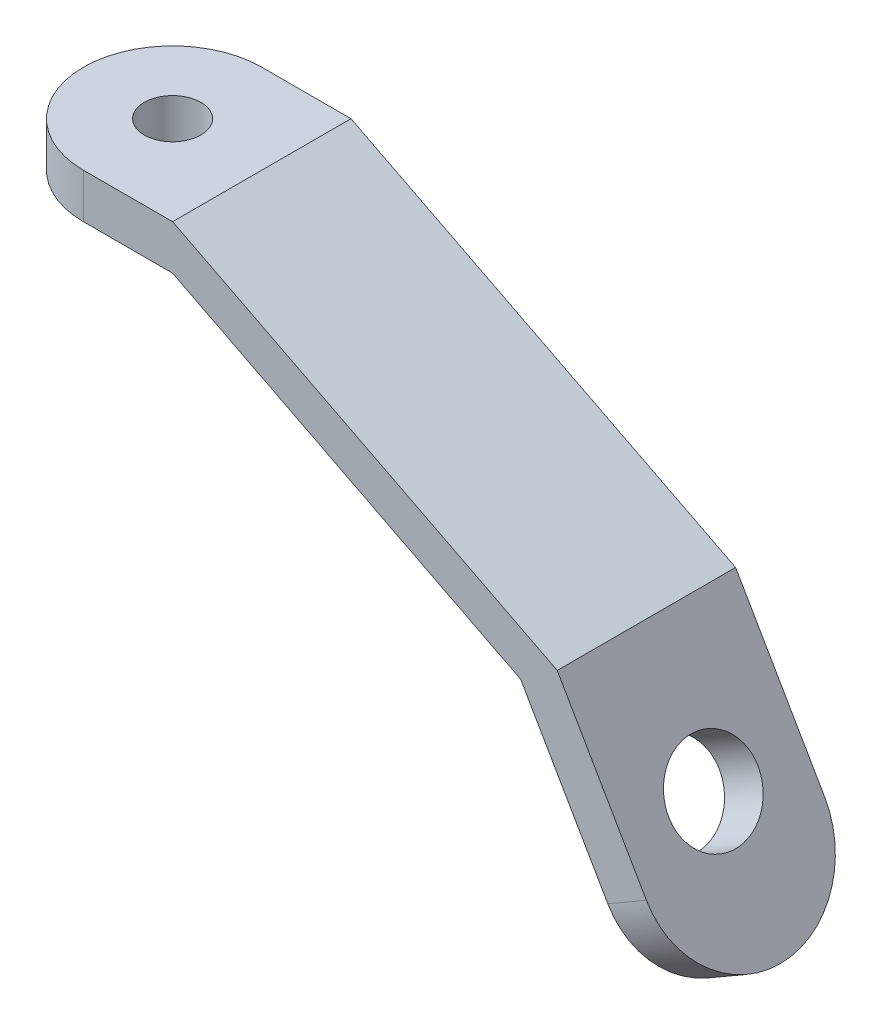
ISO-10303-21;
HEADER;
FILE_DESCRIPTION(('STEP AP214'),'2;1');
FILE_NAME('part.step','',(''),(''),'','','');
FILE_SCHEMA(('AUTOMOTIVE_DESIGN { 1 0 10303 214 1 1 1 1 }'));
ENDSEC;
DATA;
#1=APPLICATION_CONTEXT('core data for automotive mechanical design processes');
#2=APPLICATION_PROTOCOL_DEFINITION('international standard','automotive_design',2000,#1);
#3=PRODUCT_CONTEXT('',#1,'mechanical');
#4=PRODUCT('Part','Part','',(#3));
#5=PRODUCT_RELATED_PRODUCT_CATEGORY('part','',(#4));
#6=PRODUCT_DEFINITION_FORMATION('','',#4);
#7=PRODUCT_DEFINITION_CONTEXT('part definition',#1,'design');
#8=PRODUCT_DEFINITION('design','',#6,#7);
#9=PRODUCT_DEFINITION_SHAPE('','',#8);
#10=(LENGTH_UNIT() NAMED_UNIT(*) SI_UNIT(.MILLI.,.METRE.));
#11=(NAMED_UNIT(*) PLANE_ANGLE_UNIT() SI_UNIT($,.RADIAN.));
#12=(NAMED_UNIT(*) SI_UNIT($,.STERADIAN.) SOLID_ANGLE_UNIT());
#13=UNCERTAINTY_MEASURE_WITH_UNIT(LENGTH_MEASURE(1.E-05),#10,'distance_accuracy_value','');
#14=(GEOMETRIC_REPRESENTATION_CONTEXT(3) GLOBAL_UNCERTAINTY_ASSIGNED_CONTEXT((#13)) GLOBAL_UNIT_ASSIGNED_CONTEXT((#10,
#11,#12)) REPRESENTATION_CONTEXT('',''));
#15=CARTESIAN_POINT('',(0.,0.,0.));
#16=DIRECTION('',(0.,0.,1.));
#17=DIRECTION('',(1.,0.,0.));
#18=AXIS2_PLACEMENT_3D('',#15,#16,#17);
#19=CARTESIAN_POINT('',(-10.,65.,10.));
#20=DIRECTION('',(0.,1.,0.));
#21=DIRECTION('',(0.,0.,1.));
#22=AXIS2_PLACEMENT_3D('',#19,#20,#21);
#23=PLANE('',#22);
#24=CARTESIAN_POINT('',(0.,65.,0.));
#25=DIRECTION('',(0.,1.,0.));
#26=DIRECTION('',(0.,0.,1.));
#27=AXIS2_PLACEMENT_3D('',#24,#25,#26);
#28=CIRCLE('',#27,3.175);
#29=CARTESIAN_POINT('',(0.,65.,3.175));
#30=VERTEX_POINT('',#29);
#31=EDGE_CURVE('E145',#30,#30,#28,.T.);
#32=ORIENTED_EDGE('',*,*,#31,.T.);
#33=EDGE_LOOP('',(#32));
#34=FACE_BOUND('',#33,.T.);
#35=CARTESIAN_POINT('',(0.,65.,0.));
#36=DIRECTION('',(0.,1.,0.));
#37=DIRECTION('',(0.,0.,1.));
#38=AXIS2_PLACEMENT_3D('',#35,#36,#37);
#39=CIRCLE('',#38,10.);
#40=CARTESIAN_POINT('',(0.,65.,10.));
#41=VERTEX_POINT('',#40);
#42=CARTESIAN_POINT('',(-10.,65.,0.));
#43=VERTEX_POINT('',#42);
#44=EDGE_CURVE('E54',#41,#43,#39,.F.);
#45=ORIENTED_EDGE('',*,*,#44,.T.);
#46=CARTESIAN_POINT('',(0.,65.,0.));
#47=DIRECTION('',(0.,1.,0.));
#48=DIRECTION('',(0.,0.,1.));
#49=AXIS2_PLACEMENT_3D('',#46,#47,#48);
#50=CIRCLE('',#49,10.);
#51=CARTESIAN_POINT('',(0.,65.,-10.));
#52=VERTEX_POINT('',#51);
#53=EDGE_CURVE('E178',#43,#52,#50,.F.);
#54=ORIENTED_EDGE('',*,*,#53,.T.);
#55=DIRECTION('',(1.,0.,0.));
#56=VECTOR('',#55,1.);
#57=CARTESIAN_POINT('',(-10.,65.,-10.));
#58=LINE('',#57,#56);
#59=CARTESIAN_POINT('',(10.,65.,-10.));
#60=VERTEX_POINT('',#59);
#61=EDGE_CURVE('E122',#52,#60,#58,.T.);
#62=ORIENTED_EDGE('',*,*,#61,.T.);
#63=DIRECTION('',(0.,0.,-1.));
#64=VECTOR('',#63,1.);
#65=CARTESIAN_POINT('',(10.,65.,10.));
#66=LINE('',#65,#64);
#67=CARTESIAN_POINT('',(10.,65.,10.));
#68=VERTEX_POINT('',#67);
#69=EDGE_CURVE('E120',#68,#60,#66,.T.);
#70=ORIENTED_EDGE('',*,*,#69,.F.);
#71=DIRECTION('',(1.,0.,0.));
#72=VECTOR('',#71,1.);
#73=CARTESIAN_POINT('',(-10.,65.,10.));
#74=LINE('',#73,#72);
#75=EDGE_CURVE('E107',#41,#68,#74,.T.);
#76=ORIENTED_EDGE('',*,*,#75,.F.);
#77=EDGE_LOOP('',(#45,#54,#62,#70,#76));
#78=FACE_BOUND('',#77,.T.);
#79=ADVANCED_FACE('F31',(#34,#78),#23,.F.);
#80=CARTESIAN_POINT('',(10.,65.,10.));
#81=DIRECTION('',(0.454613111401703,0.890689013596588,0.));
#82=DIRECTION('',(-0.890689013596588,0.454613111401703,0.));
#83=AXIS2_PLACEMENT_3D('',#80,#81,#82);
#84=PLANE('',#83);
#85=DIRECTION('',(0.890689013596588,-0.454613111401703,0.));
#86=VECTOR('',#85,1.);
#87=CARTESIAN_POINT('',(10.,65.,-10.));
#88=LINE('',#87,#86);
#89=CARTESIAN_POINT('',(49.0289352353247,45.0793931314137,-10.));
#90=VERTEX_POINT('',#89);
#91=EDGE_CURVE('E144',#60,#90,#88,.T.);
#92=ORIENTED_EDGE('',*,*,#91,.T.);
#93=DIRECTION('',(0.,0.,-1.));
#94=VECTOR('',#93,1.);
#95=CARTESIAN_POINT('',(49.0289352353247,45.0793931314137,10.));
#96=LINE('',#95,#94);
#97=CARTESIAN_POINT('',(49.0289352353247,45.0793931314137,10.));
#98=VERTEX_POINT('',#97);
#99=EDGE_CURVE('E126',#98,#90,#96,.T.);
#100=ORIENTED_EDGE('',*,*,#99,.F.);
#101=DIRECTION('',(0.890689013596588,-0.454613111401703,0.));
#102=VECTOR('',#101,1.);
#103=CARTESIAN_POINT('',(10.,65.,10.));
#104=LINE('',#103,#102);
#105=EDGE_CURVE('E112',#68,#98,#104,.T.);
#106=ORIENTED_EDGE('',*,*,#105,.F.);
#107=ORIENTED_EDGE('',*,*,#69,.T.);
#108=EDGE_LOOP('',(#92,#100,#106,#107));
#109=FACE_BOUND('',#108,.T.);
#110=ADVANCED_FACE('F128',(#109),#84,.F.);
#111=CARTESIAN_POINT('',(49.0289352353247,45.0793931314137,10.));
#112=DIRECTION('',(0.86602540378444,0.499999999999998,0.));
#113=DIRECTION('',(-0.499999999999998,0.86602540378444,0.));
#114=AXIS2_PLACEMENT_3D('',#111,#112,#113);
#115=PLANE('',#114);
#116=CARTESIAN_POINT('',(56.2916512459886,32.4999999999999,0.));
#117=DIRECTION('',(0.86602540378444,0.499999999999998,0.));
#118=DIRECTION('',(-0.499999999999998,0.86602540378444,0.));
#119=AXIS2_PLACEMENT_3D('',#116,#117,#118);
#120=CIRCLE('',#119,5.);
#121=CARTESIAN_POINT('',(53.7916512459886,36.8301270189221,0.));
#122=VERTEX_POINT('',#121);
#123=EDGE_CURVE('E187',#122,#122,#120,.T.);
#124=ORIENTED_EDGE('',*,*,#123,.T.);
#125=EDGE_LOOP('',(#124));
#126=FACE_BOUND('',#125,.T.);
#127=DIRECTION('',(0.499999999999998,-0.86602540378444,0.));
#128=VECTOR('',#127,1.);
#129=CARTESIAN_POINT('',(49.0289352353247,45.0793931314137,-10.));
#130=LINE('',#129,#128);
#131=CARTESIAN_POINT('',(58.7916512459886,28.1698729810777,-10.));
#132=VERTEX_POINT('',#131);
#133=EDGE_CURVE('E147',#90,#132,#130,.T.);
#134=ORIENTED_EDGE('',*,*,#133,.T.);
#135=CARTESIAN_POINT('',(58.7916512459886,28.1698729810777,0.));
#136=DIRECTION('',(0.86602540378444,0.499999999999998,0.));
#137=DIRECTION('',(-0.499999999999998,0.86602540378444,0.));
#138=AXIS2_PLACEMENT_3D('',#135,#136,#137);
#139=CIRCLE('',#138,10.);
#140=CARTESIAN_POINT('',(63.7916512459886,19.5096189432333,0.));
#141=VERTEX_POINT('',#140);
#142=EDGE_CURVE('E172',#132,#141,#139,.F.);
#143=ORIENTED_EDGE('',*,*,#142,.T.);
#144=CARTESIAN_POINT('',(58.7916512459886,28.1698729810777,0.));
#145=DIRECTION('',(0.86602540378444,0.499999999999998,0.));
#146=DIRECTION('',(-0.499999999999998,0.86602540378444,0.));
#147=AXIS2_PLACEMENT_3D('',#144,#145,#146);
#148=CIRCLE('',#147,10.);
#149=CARTESIAN_POINT('',(58.7916512459886,28.1698729810777,10.));
#150=VERTEX_POINT('',#149);
#151=EDGE_CURVE('E170',#141,#150,#148,.F.);
#152=ORIENTED_EDGE('',*,*,#151,.T.);
#153=DIRECTION('',(0.499999999999998,-0.86602540378444,0.));
#154=VECTOR('',#153,1.);
#155=CARTESIAN_POINT('',(49.0289352353247,45.0793931314137,10.));
#156=LINE('',#155,#154);
#157=EDGE_CURVE('E131',#98,#150,#156,.T.);
#158=ORIENTED_EDGE('',*,*,#157,.F.);
#159=ORIENTED_EDGE('',*,*,#99,.T.);
#160=EDGE_LOOP('',(#134,#143,#152,#158,#159));
#161=FACE_BOUND('',#160,.T.);
#162=ADVANCED_FACE('F210',(#126,#161),#115,.F.);
#163=CARTESIAN_POINT('',(53.1217782649108,47.9903810567665,10.));
#164=DIRECTION('',(-0.86602540378444,-0.499999999999998,0.));
#165=DIRECTION('',(0.499999999999998,-0.86602540378444,0.));
#166=AXIS2_PLACEMENT_3D('',#163,#164,#165);
#167=PLANE('',#166);
#168=CARTESIAN_POINT('',(60.6217782649108,34.9999999999999,0.));
#169=DIRECTION('',(0.86602540378444,0.499999999999998,0.));
#170=DIRECTION('',(-0.499999999999998,0.86602540378444,0.));
#171=AXIS2_PLACEMENT_3D('',#168,#169,#170);
#172=CIRCLE('',#171,5.);
#173=CARTESIAN_POINT('',(58.1217782649108,39.3301270189221,0.));
#174=VERTEX_POINT('',#173);
#175=EDGE_CURVE('E182',#174,#174,#172,.T.);
#176=ORIENTED_EDGE('',*,*,#175,.F.);
#177=EDGE_LOOP('',(#176));
#178=FACE_BOUND('',#177,.T.);
#179=CARTESIAN_POINT('',(63.1217782649108,30.6698729810777,0.));
#180=DIRECTION('',(-0.86602540378444,-0.499999999999998,0.));
#181=DIRECTION('',(0.499999999999998,-0.86602540378444,0.));
#182=AXIS2_PLACEMENT_3D('',#179,#180,#181);
#183=CIRCLE('',#182,10.);
#184=CARTESIAN_POINT('',(63.1217782649108,30.6698729810777,10.));
#185=VERTEX_POINT('',#184);
#186=CARTESIAN_POINT('',(68.1217782649107,22.0096189432333,0.));
#187=VERTEX_POINT('',#186);
#188=EDGE_CURVE('E125',#185,#187,#183,.F.);
#189=ORIENTED_EDGE('',*,*,#188,.T.);
#190=CARTESIAN_POINT('',(63.1217782649108,30.6698729810777,0.));
#191=DIRECTION('',(-0.86602540378444,-0.499999999999998,0.));
#192=DIRECTION('',(0.499999999999998,-0.86602540378444,0.));
#193=AXIS2_PLACEMENT_3D('',#190,#191,#192);
#194=CIRCLE('',#193,10.);
#195=CARTESIAN_POINT('',(63.1217782649108,30.6698729810777,-10.));
#196=VERTEX_POINT('',#195);
#197=EDGE_CURVE('E162',#187,#196,#194,.F.);
#198=ORIENTED_EDGE('',*,*,#197,.T.);
#199=DIRECTION('',(-0.499999999999998,0.86602540378444,0.));
#200=VECTOR('',#199,1.);
#201=CARTESIAN_POINT('',(53.1217782649108,47.9903810567665,-10.));
#202=LINE('',#201,#200);
#203=CARTESIAN_POINT('',(53.1217782649108,47.9903810567665,-10.));
#204=VERTEX_POINT('',#203);
#205=EDGE_CURVE('E150',#196,#204,#202,.T.);
#206=ORIENTED_EDGE('',*,*,#205,.T.);
#207=DIRECTION('',(0.,0.,-1.));
#208=VECTOR('',#207,1.);
#209=CARTESIAN_POINT('',(53.1217782649108,47.9903810567665,10.));
#210=LINE('',#209,#208);
#211=CARTESIAN_POINT('',(53.1217782649108,47.9903810567665,10.));
#212=VERTEX_POINT('',#211);
#213=EDGE_CURVE('E157',#212,#204,#210,.T.);
#214=ORIENTED_EDGE('',*,*,#213,.F.);
#215=DIRECTION('',(-0.499999999999998,0.86602540378444,0.));
#216=VECTOR('',#215,1.);
#217=CARTESIAN_POINT('',(53.1217782649108,47.9903810567665,10.));
#218=LINE('',#217,#216);
#219=EDGE_CURVE('E133',#185,#212,#218,.T.);
#220=ORIENTED_EDGE('',*,*,#219,.F.);
#221=EDGE_LOOP('',(#189,#198,#206,#214,#220));
#222=FACE_BOUND('',#221,.T.);
#223=ADVANCED_FACE('F217',(#178,#222),#167,.F.);
#224=CARTESIAN_POINT('',(10.,70.,10.));
#225=DIRECTION('',(-0.454613111401704,-0.890689013596588,0.));
#226=DIRECTION('',(0.890689013596588,-0.454613111401704,0.));
#227=AXIS2_PLACEMENT_3D('',#224,#225,#226);
#228=PLANE('',#227);
#229=DIRECTION('',(-0.890689013596587,0.454613111401704,0.));
#230=VECTOR('',#229,1.);
#231=CARTESIAN_POINT('',(10.,70.,-10.));
#232=LINE('',#231,#230);
#233=CARTESIAN_POINT('',(10.,70.,-10.));
#234=VERTEX_POINT('',#233);
#235=EDGE_CURVE('E152',#204,#234,#232,.T.);
#236=ORIENTED_EDGE('',*,*,#235,.T.);
#237=DIRECTION('',(0.,0.,-1.));
#238=VECTOR('',#237,1.);
#239=CARTESIAN_POINT('',(10.,70.,10.));
#240=LINE('',#239,#238);
#241=CARTESIAN_POINT('',(10.,70.,10.));
#242=VERTEX_POINT('',#241);
#243=EDGE_CURVE('E142',#242,#234,#240,.T.);
#244=ORIENTED_EDGE('',*,*,#243,.F.);
#245=DIRECTION('',(-0.890689013596587,0.454613111401704,0.));
#246=VECTOR('',#245,1.);
#247=CARTESIAN_POINT('',(10.,70.,10.));
#248=LINE('',#247,#246);
#249=EDGE_CURVE('E138',#212,#242,#248,.T.);
#250=ORIENTED_EDGE('',*,*,#249,.F.);
#251=ORIENTED_EDGE('',*,*,#213,.T.);
#252=EDGE_LOOP('',(#236,#244,#250,#251));
#253=FACE_BOUND('',#252,.T.);
#254=ADVANCED_FACE('F202',(#253),#228,.F.);
#255=CARTESIAN_POINT('',(-10.,70.,10.));
#256=DIRECTION('',(0.,-1.,0.));
#257=DIRECTION('',(0.,0.,-1.));
#258=AXIS2_PLACEMENT_3D('',#255,#256,#257);
#259=PLANE('',#258);
#260=CARTESIAN_POINT('',(0.,70.,0.));
#261=DIRECTION('',(0.,1.,0.));
#262=DIRECTION('',(0.,0.,1.));
#263=AXIS2_PLACEMENT_3D('',#260,#261,#262);
#264=CIRCLE('',#263,3.175);
#265=CARTESIAN_POINT('',(0.,70.,3.175));
#266=VERTEX_POINT('',#265);
#267=EDGE_CURVE('E264',#266,#266,#264,.T.);
#268=ORIENTED_EDGE('',*,*,#267,.F.);
#269=EDGE_LOOP('',(#268));
#270=FACE_BOUND('',#269,.T.);
#271=DIRECTION('',(-1.,0.,0.));
#272=VECTOR('',#271,1.);
#273=CARTESIAN_POINT('',(-10.,70.,-10.));
#274=LINE('',#273,#272);
#275=CARTESIAN_POINT('',(0.,70.,-10.));
#276=VERTEX_POINT('',#275);
#277=EDGE_CURVE('E117',#234,#276,#274,.T.);
#278=ORIENTED_EDGE('',*,*,#277,.T.);
#279=CARTESIAN_POINT('',(0.,70.,0.));
#280=DIRECTION('',(0.,-1.,0.));
#281=DIRECTION('',(0.,0.,-1.));
#282=AXIS2_PLACEMENT_3D('',#279,#280,#281);
#283=CIRCLE('',#282,10.);
#284=CARTESIAN_POINT('',(-10.,70.,0.));
#285=VERTEX_POINT('',#284);
#286=EDGE_CURVE('E11',#276,#285,#283,.F.);
#287=ORIENTED_EDGE('',*,*,#286,.T.);
#288=CARTESIAN_POINT('',(0.,70.,0.));
#289=DIRECTION('',(0.,-1.,0.));
#290=DIRECTION('',(0.,0.,-1.));
#291=AXIS2_PLACEMENT_3D('',#288,#289,#290);
#292=CIRCLE('',#291,10.);
#293=CARTESIAN_POINT('',(0.,70.,10.));
#294=VERTEX_POINT('',#293);
#295=EDGE_CURVE('E40',#285,#294,#292,.F.);
#296=ORIENTED_EDGE('',*,*,#295,.T.);
#297=DIRECTION('',(-1.,0.,0.));
#298=VECTOR('',#297,1.);
#299=CARTESIAN_POINT('',(-10.,70.,10.));
#300=LINE('',#299,#298);
#301=EDGE_CURVE('E140',#242,#294,#300,.T.);
#302=ORIENTED_EDGE('',*,*,#301,.F.);
#303=ORIENTED_EDGE('',*,*,#243,.T.);
#304=EDGE_LOOP('',(#278,#287,#296,#302,#303));
#305=FACE_BOUND('',#304,.T.);
#306=ADVANCED_FACE('F196',(#270,#305),#259,.F.);
#307=CARTESIAN_POINT('',(-10.,65.,10.));
#308=DIRECTION('',(0.,0.,1.));
#309=DIRECTION('',(1.,0.,0.));
#310=AXIS2_PLACEMENT_3D('',#307,#308,#309);
#311=PLANE('',#310);
#312=ORIENTED_EDGE('',*,*,#157,.T.);
#313=DIRECTION('',(0.866025403784439,0.499999999999999,0.));
#314=VECTOR('',#313,1.);
#315=CARTESIAN_POINT('',(63.1217782649108,30.6698729810777,10.));
#316=LINE('',#315,#314);
#317=EDGE_CURVE('E175',#150,#185,#316,.T.);
#318=ORIENTED_EDGE('',*,*,#317,.T.);
#319=ORIENTED_EDGE('',*,*,#219,.T.);
#320=ORIENTED_EDGE('',*,*,#249,.T.);
#321=ORIENTED_EDGE('',*,*,#301,.T.);
#322=DIRECTION('',(0.,-1.,0.));
#323=VECTOR('',#322,1.);
#324=CARTESIAN_POINT('',(0.,65.,10.));
#325=LINE('',#324,#323);
#326=EDGE_CURVE('E116',#294,#41,#325,.T.);
#327=ORIENTED_EDGE('',*,*,#326,.T.);
#328=ORIENTED_EDGE('',*,*,#75,.T.);
#329=ORIENTED_EDGE('',*,*,#105,.T.);
#330=EDGE_LOOP('',(#312,#318,#319,#320,#321,#327,#328,#329));
#331=FACE_BOUND('',#330,.T.);
#332=ADVANCED_FACE('F110',(#331),#311,.T.);
#333=CARTESIAN_POINT('',(-10.,65.,-10.));
#334=DIRECTION('',(0.,0.,1.));
#335=DIRECTION('',(1.,0.,0.));
#336=AXIS2_PLACEMENT_3D('',#333,#334,#335);
#337=PLANE('',#336);
#338=ORIENTED_EDGE('',*,*,#205,.F.);
#339=DIRECTION('',(0.866025403784439,0.499999999999999,0.));
#340=VECTOR('',#339,1.);
#341=CARTESIAN_POINT('',(23.1458256229942,7.58974596215548,-10.));
#342=LINE('',#341,#340);
#343=EDGE_CURVE('E167',#196,#132,#342,.F.);
#344=ORIENTED_EDGE('',*,*,#343,.T.);
#345=ORIENTED_EDGE('',*,*,#133,.F.);
#346=ORIENTED_EDGE('',*,*,#91,.F.);
#347=ORIENTED_EDGE('',*,*,#61,.F.);
#348=DIRECTION('',(0.,-1.,0.));
#349=VECTOR('',#348,1.);
#350=CARTESIAN_POINT('',(0.,65.,-10.));
#351=LINE('',#350,#349);
#352=EDGE_CURVE('E164',#52,#276,#351,.F.);
#353=ORIENTED_EDGE('',*,*,#352,.T.);
#354=ORIENTED_EDGE('',*,*,#277,.F.);
#355=ORIENTED_EDGE('',*,*,#235,.F.);
#356=EDGE_LOOP('',(#338,#344,#345,#346,#347,#353,#354,#355));
#357=FACE_BOUND('',#356,.T.);
#358=ADVANCED_FACE('F207',(#357),#337,.F.);
#359=CARTESIAN_POINT('',(0.,19.5096189432333,0.));
#360=DIRECTION('',(0.,1.,0.));
#361=DIRECTION('',(0.,0.,1.));
#362=AXIS2_PLACEMENT_3D('',#359,#360,#361);
#363=CYLINDRICAL_SURFACE('',#362,3.175);
#364=ORIENTED_EDGE('',*,*,#267,.T.);
#365=EDGE_LOOP('',(#364));
#366=FACE_BOUND('',#365,.T.);
#367=ORIENTED_EDGE('',*,*,#31,.F.);
#368=EDGE_LOOP('',(#367));
#369=FACE_BOUND('',#368,.T.);
#370=ADVANCED_FACE('F250',(#366,#369),#363,.F.);
#371=CARTESIAN_POINT('',(0.947912811497031,0.547277716886105,0.));
#372=DIRECTION('',(0.86602540378444,0.499999999999998,0.));
#373=DIRECTION('',(-0.499999999999998,0.86602540378444,0.));
#374=AXIS2_PLACEMENT_3D('',#371,#372,#373);
#375=CYLINDRICAL_SURFACE('',#374,5.);
#376=ORIENTED_EDGE('',*,*,#175,.T.);
#377=EDGE_LOOP('',(#376));
#378=FACE_BOUND('',#377,.T.);
#379=ORIENTED_EDGE('',*,*,#123,.F.);
#380=EDGE_LOOP('',(#379));
#381=FACE_BOUND('',#380,.T.);
#382=ADVANCED_FACE('F226',(#378,#381),#375,.F.);
#383=CARTESIAN_POINT('',(23.1458256229942,7.58974596215548,0.));
#384=DIRECTION('',(-0.866025403784439,-0.499999999999999,0.));
#385=DIRECTION('',(0.499999999999999,-0.866025403784439,0.));
#386=AXIS2_PLACEMENT_3D('',#383,#384,#385);
#387=CYLINDRICAL_SURFACE('',#386,10.);
#388=ORIENTED_EDGE('',*,*,#317,.F.);
#389=ORIENTED_EDGE('',*,*,#151,.F.);
#390=DIRECTION('',(0.866025403784439,0.499999999999999,0.));
#391=VECTOR('',#390,1.);
#392=CARTESIAN_POINT('',(63.7916512459886,19.5096189432333,0.));
#393=LINE('',#392,#391);
#394=EDGE_CURVE('E180',#187,#141,#393,.F.);
#395=ORIENTED_EDGE('',*,*,#394,.F.);
#396=ORIENTED_EDGE('',*,*,#188,.F.);
#397=EDGE_LOOP('',(#388,#389,#395,#396));
#398=FACE_BOUND('',#397,.T.);
#399=ADVANCED_FACE('F215',(#398),#387,.T.);
#400=CARTESIAN_POINT('',(58.7916512459886,28.1698729810777,0.));
#401=DIRECTION('',(0.866025403784439,0.499999999999999,0.));
#402=DIRECTION('',(-0.499999999999999,0.866025403784439,0.));
#403=AXIS2_PLACEMENT_3D('',#400,#401,#402);
#404=CYLINDRICAL_SURFACE('',#403,10.);
#405=ORIENTED_EDGE('',*,*,#142,.F.);
#406=ORIENTED_EDGE('',*,*,#343,.F.);
#407=ORIENTED_EDGE('',*,*,#197,.F.);
#408=ORIENTED_EDGE('',*,*,#394,.T.);
#409=EDGE_LOOP('',(#405,#406,#407,#408));
#410=FACE_BOUND('',#409,.T.);
#411=ADVANCED_FACE('F219',(#410),#404,.T.);
#412=CARTESIAN_POINT('',(0.,65.,0.));
#413=DIRECTION('',(0.,1.,0.));
#414=DIRECTION('',(0.,0.,1.));
#415=AXIS2_PLACEMENT_3D('',#412,#413,#414);
#416=CYLINDRICAL_SURFACE('',#415,10.);
#417=ORIENTED_EDGE('',*,*,#326,.F.);
#418=ORIENTED_EDGE('',*,*,#295,.F.);
#419=DIRECTION('',(0.,-1.,0.));
#420=VECTOR('',#419,1.);
#421=CARTESIAN_POINT('',(-10.,70.,0.));
#422=LINE('',#421,#420);
#423=EDGE_CURVE('E35',#43,#285,#422,.F.);
#424=ORIENTED_EDGE('',*,*,#423,.F.);
#425=ORIENTED_EDGE('',*,*,#44,.F.);
#426=EDGE_LOOP('',(#417,#418,#424,#425));
#427=FACE_BOUND('',#426,.T.);
#428=ADVANCED_FACE('F33',(#427),#416,.T.);
#429=CARTESIAN_POINT('',(0.,70.,0.));
#430=DIRECTION('',(0.,-1.,0.));
#431=DIRECTION('',(0.,0.,-1.));
#432=AXIS2_PLACEMENT_3D('',#429,#430,#431);
#433=CYLINDRICAL_SURFACE('',#432,10.);
#434=ORIENTED_EDGE('',*,*,#286,.F.);
#435=ORIENTED_EDGE('',*,*,#352,.F.);
#436=ORIENTED_EDGE('',*,*,#53,.F.);
#437=ORIENTED_EDGE('',*,*,#423,.T.);
#438=EDGE_LOOP('',(#434,#435,#436,#437));
#439=FACE_BOUND('',#438,.T.);
#440=ADVANCED_FACE('F192',(#439),#433,.T.);
#441=CLOSED_SHELL('',(#79,#110,#162,#223,#254,#306,#332,#358,#370,#382,#399,#411,#428,#440));
#442=MANIFOLD_SOLID_BREP('B2',#441);
#443=ADVANCED_BREP_SHAPE_REPRESENTATION('',(#18,#442),#14);
#444=SHAPE_DEFINITION_REPRESENTATION(#9,#443);
ENDSEC;
END-ISO-10303-21;
